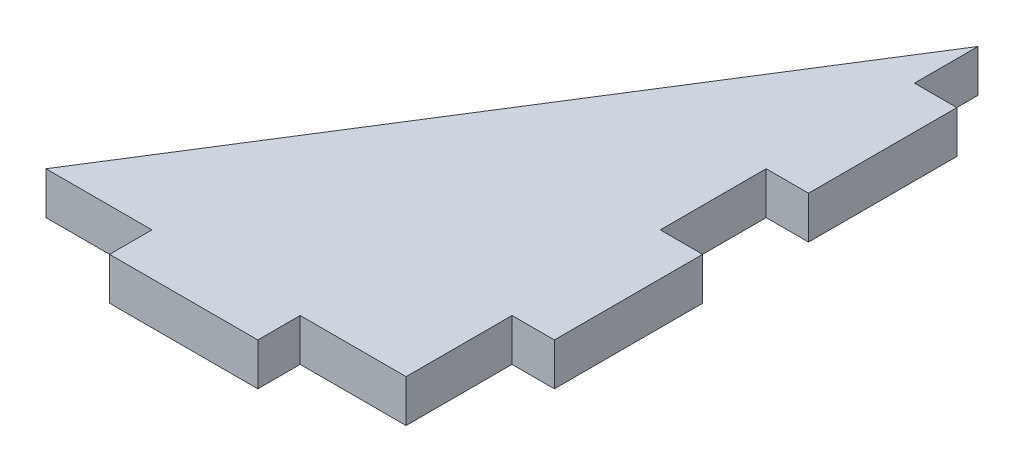
ISO-10303-21;
HEADER;
FILE_DESCRIPTION(('STEP AP214'),'2;1');
FILE_NAME('part.step','',(''),(''),'','','');
FILE_SCHEMA(('AUTOMOTIVE_DESIGN { 1 0 10303 214 1 1 1 1 }'));
ENDSEC;
DATA;
#1=APPLICATION_CONTEXT('core data for automotive mechanical design processes');
#2=APPLICATION_PROTOCOL_DEFINITION('international standard','automotive_design',2000,#1);
#3=PRODUCT_CONTEXT('',#1,'mechanical');
#4=PRODUCT('Part','Part','',(#3));
#5=PRODUCT_RELATED_PRODUCT_CATEGORY('part','',(#4));
#6=PRODUCT_DEFINITION_FORMATION('','',#4);
#7=PRODUCT_DEFINITION_CONTEXT('part definition',#1,'design');
#8=PRODUCT_DEFINITION('design','',#6,#7);
#9=PRODUCT_DEFINITION_SHAPE('','',#8);
#10=(LENGTH_UNIT() NAMED_UNIT(*) SI_UNIT(.MILLI.,.METRE.));
#11=(NAMED_UNIT(*) PLANE_ANGLE_UNIT() SI_UNIT($,.RADIAN.));
#12=(NAMED_UNIT(*) SI_UNIT($,.STERADIAN.) SOLID_ANGLE_UNIT());
#13=UNCERTAINTY_MEASURE_WITH_UNIT(LENGTH_MEASURE(1.E-05),#10,'distance_accuracy_value','');
#14=(GEOMETRIC_REPRESENTATION_CONTEXT(3) GLOBAL_UNCERTAINTY_ASSIGNED_CONTEXT((#13)) GLOBAL_UNIT_ASSIGNED_CONTEXT((#10,
#11,#12)) REPRESENTATION_CONTEXT('',''));
#15=CARTESIAN_POINT('',(0.,0.,0.));
#16=DIRECTION('',(0.,0.,1.));
#17=DIRECTION('',(1.,0.,0.));
#18=AXIS2_PLACEMENT_3D('',#15,#16,#17);
#19=CARTESIAN_POINT('',(0.,2.,0.));
#20=DIRECTION('',(1.,0.,0.));
#21=DIRECTION('',(0.,0.,-1.));
#22=AXIS2_PLACEMENT_3D('',#19,#20,#21);
#23=PLANE('',#22);
#24=DIRECTION('',(0.,0.,1.));
#25=VECTOR('',#24,1.);
#26=CARTESIAN_POINT('',(0.,0.,0.));
#27=LINE('',#26,#25);
#28=CARTESIAN_POINT('',(0.,0.,-27.));
#29=VERTEX_POINT('',#28);
#30=CARTESIAN_POINT('',(0.,0.,-24.));
#31=VERTEX_POINT('',#30);
#32=EDGE_CURVE('E171',#29,#31,#27,.T.);
#33=ORIENTED_EDGE('',*,*,#32,.F.);
#34=DIRECTION('',(0.,-1.,0.));
#35=VECTOR('',#34,1.);
#36=CARTESIAN_POINT('',(0.,2.,-27.));
#37=LINE('',#36,#35);
#38=CARTESIAN_POINT('',(0.,2.,-27.));
#39=VERTEX_POINT('',#38);
#40=EDGE_CURVE('E11',#39,#29,#37,.T.);
#41=ORIENTED_EDGE('',*,*,#40,.F.);
#42=DIRECTION('',(0.,0.,1.));
#43=VECTOR('',#42,1.);
#44=CARTESIAN_POINT('',(0.,2.,0.));
#45=LINE('',#44,#43);
#46=CARTESIAN_POINT('',(0.,2.,-24.));
#47=VERTEX_POINT('',#46);
#48=EDGE_CURVE('E204',#39,#47,#45,.T.);
#49=ORIENTED_EDGE('',*,*,#48,.T.);
#50=DIRECTION('',(0.,-1.,0.));
#51=VECTOR('',#50,1.);
#52=CARTESIAN_POINT('',(0.,2.,-24.));
#53=LINE('',#52,#51);
#54=EDGE_CURVE('E52',#47,#31,#53,.T.);
#55=ORIENTED_EDGE('',*,*,#54,.T.);
#56=EDGE_LOOP('',(#33,#41,#49,#55));
#57=FACE_BOUND('',#56,.T.);
#58=ADVANCED_FACE('F35',(#57),#23,.T.);
#59=CARTESIAN_POINT('',(-12.1738703339882,2.,-7.66502946954813));
#60=DIRECTION('',(-0.846232840089751,0.,-0.532813269686139));
#61=DIRECTION('',(-0.532813269686139,0.,0.846232840089751));
#62=AXIS2_PLACEMENT_3D('',#59,#60,#61);
#63=PLANE('',#62);
#64=DIRECTION('',(0.532813269686139,0.,-0.846232840089751));
#65=VECTOR('',#64,1.);
#66=CARTESIAN_POINT('',(-12.1738703339882,0.,-7.66502946954813));
#67=LINE('',#66,#65);
#68=CARTESIAN_POINT('',(-17.,0.,0.));
#69=VERTEX_POINT('',#68);
#70=EDGE_CURVE('E173',#69,#29,#67,.T.);
#71=ORIENTED_EDGE('',*,*,#70,.F.);
#72=DIRECTION('',(0.,-1.,0.));
#73=VECTOR('',#72,1.);
#74=CARTESIAN_POINT('',(-17.,2.,0.));
#75=LINE('',#74,#73);
#76=CARTESIAN_POINT('',(-17.,2.,0.));
#77=VERTEX_POINT('',#76);
#78=EDGE_CURVE('E44',#77,#69,#75,.T.);
#79=ORIENTED_EDGE('',*,*,#78,.F.);
#80=DIRECTION('',(0.532813269686139,0.,-0.846232840089751));
#81=VECTOR('',#80,1.);
#82=CARTESIAN_POINT('',(-12.1738703339882,2.,-7.66502946954813));
#83=LINE('',#82,#81);
#84=EDGE_CURVE('E271',#77,#39,#83,.T.);
#85=ORIENTED_EDGE('',*,*,#84,.T.);
#86=ORIENTED_EDGE('',*,*,#40,.T.);
#87=EDGE_LOOP('',(#71,#79,#85,#86));
#88=FACE_BOUND('',#87,.T.);
#89=ADVANCED_FACE('F37',(#88),#63,.T.);
#90=CARTESIAN_POINT('',(0.,2.,0.));
#91=DIRECTION('',(0.,0.,1.));
#92=DIRECTION('',(1.,0.,0.));
#93=AXIS2_PLACEMENT_3D('',#90,#91,#92);
#94=PLANE('',#93);
#95=DIRECTION('',(-1.,0.,0.));
#96=VECTOR('',#95,1.);
#97=CARTESIAN_POINT('',(0.,0.,0.));
#98=LINE('',#97,#96);
#99=CARTESIAN_POINT('',(-12.,0.,0.));
#100=VERTEX_POINT('',#99);
#101=EDGE_CURVE('E178',#100,#69,#98,.T.);
#102=ORIENTED_EDGE('',*,*,#101,.F.);
#103=DIRECTION('',(0.,-1.,0.));
#104=VECTOR('',#103,1.);
#105=CARTESIAN_POINT('',(-12.,2.,0.));
#106=LINE('',#105,#104);
#107=CARTESIAN_POINT('',(-12.,2.,0.));
#108=VERTEX_POINT('',#107);
#109=EDGE_CURVE('E226',#108,#100,#106,.T.);
#110=ORIENTED_EDGE('',*,*,#109,.F.);
#111=DIRECTION('',(-1.,0.,0.));
#112=VECTOR('',#111,1.);
#113=CARTESIAN_POINT('',(0.,2.,0.));
#114=LINE('',#113,#112);
#115=EDGE_CURVE('E233',#108,#77,#114,.T.);
#116=ORIENTED_EDGE('',*,*,#115,.T.);
#117=ORIENTED_EDGE('',*,*,#78,.T.);
#118=EDGE_LOOP('',(#102,#110,#116,#117));
#119=FACE_BOUND('',#118,.T.);
#120=ADVANCED_FACE('F231',(#119),#94,.T.);
#121=CARTESIAN_POINT('',(-12.,2.,0.));
#122=DIRECTION('',(1.,0.,0.));
#123=DIRECTION('',(0.,0.,-1.));
#124=AXIS2_PLACEMENT_3D('',#121,#122,#123);
#125=PLANE('',#124);
#126=DIRECTION('',(0.,0.,1.));
#127=VECTOR('',#126,1.);
#128=CARTESIAN_POINT('',(-12.,0.,0.));
#129=LINE('',#128,#127);
#130=CARTESIAN_POINT('',(-12.,0.,2.));
#131=VERTEX_POINT('',#130);
#132=EDGE_CURVE('E181',#100,#131,#129,.T.);
#133=ORIENTED_EDGE('',*,*,#132,.T.);
#134=DIRECTION('',(0.,-1.,0.));
#135=VECTOR('',#134,1.);
#136=CARTESIAN_POINT('',(-12.,2.,2.));
#137=LINE('',#136,#135);
#138=CARTESIAN_POINT('',(-12.,2.,2.));
#139=VERTEX_POINT('',#138);
#140=EDGE_CURVE('E223',#139,#131,#137,.T.);
#141=ORIENTED_EDGE('',*,*,#140,.F.);
#142=DIRECTION('',(0.,0.,1.));
#143=VECTOR('',#142,1.);
#144=CARTESIAN_POINT('',(-12.,2.,0.));
#145=LINE('',#144,#143);
#146=EDGE_CURVE('E253',#108,#139,#145,.T.);
#147=ORIENTED_EDGE('',*,*,#146,.F.);
#148=ORIENTED_EDGE('',*,*,#109,.T.);
#149=EDGE_LOOP('',(#133,#141,#147,#148));
#150=FACE_BOUND('',#149,.T.);
#151=ADVANCED_FACE('F243',(#150),#125,.F.);
#152=CARTESIAN_POINT('',(0.,2.,2.));
#153=DIRECTION('',(0.,0.,-1.));
#154=DIRECTION('',(-1.,0.,0.));
#155=AXIS2_PLACEMENT_3D('',#152,#153,#154);
#156=PLANE('',#155);
#157=DIRECTION('',(1.,0.,0.));
#158=VECTOR('',#157,1.);
#159=CARTESIAN_POINT('',(0.,0.,2.));
#160=LINE('',#159,#158);
#161=CARTESIAN_POINT('',(-5.,0.,2.));
#162=VERTEX_POINT('',#161);
#163=EDGE_CURVE('E184',#131,#162,#160,.T.);
#164=ORIENTED_EDGE('',*,*,#163,.T.);
#165=DIRECTION('',(0.,-1.,0.));
#166=VECTOR('',#165,1.);
#167=CARTESIAN_POINT('',(-5.,2.,2.));
#168=LINE('',#167,#166);
#169=CARTESIAN_POINT('',(-5.,2.,2.));
#170=VERTEX_POINT('',#169);
#171=EDGE_CURVE('E221',#170,#162,#168,.T.);
#172=ORIENTED_EDGE('',*,*,#171,.F.);
#173=DIRECTION('',(1.,0.,0.));
#174=VECTOR('',#173,1.);
#175=CARTESIAN_POINT('',(0.,2.,2.));
#176=LINE('',#175,#174);
#177=EDGE_CURVE('E249',#139,#170,#176,.T.);
#178=ORIENTED_EDGE('',*,*,#177,.F.);
#179=ORIENTED_EDGE('',*,*,#140,.T.);
#180=EDGE_LOOP('',(#164,#172,#178,#179));
#181=FACE_BOUND('',#180,.T.);
#182=ADVANCED_FACE('F247',(#181),#156,.F.);
#183=CARTESIAN_POINT('',(-5.,2.,0.));
#184=DIRECTION('',(1.,0.,0.));
#185=DIRECTION('',(0.,0.,-1.));
#186=AXIS2_PLACEMENT_3D('',#183,#184,#185);
#187=PLANE('',#186);
#188=DIRECTION('',(0.,0.,1.));
#189=VECTOR('',#188,1.);
#190=CARTESIAN_POINT('',(-5.,0.,0.));
#191=LINE('',#190,#189);
#192=CARTESIAN_POINT('',(-5.,0.,0.));
#193=VERTEX_POINT('',#192);
#194=EDGE_CURVE('E187',#193,#162,#191,.T.);
#195=ORIENTED_EDGE('',*,*,#194,.F.);
#196=DIRECTION('',(0.,-1.,0.));
#197=VECTOR('',#196,1.);
#198=CARTESIAN_POINT('',(-5.,2.,0.));
#199=LINE('',#198,#197);
#200=CARTESIAN_POINT('',(-5.,2.,0.));
#201=VERTEX_POINT('',#200);
#202=EDGE_CURVE('E219',#201,#193,#199,.T.);
#203=ORIENTED_EDGE('',*,*,#202,.F.);
#204=DIRECTION('',(0.,0.,1.));
#205=VECTOR('',#204,1.);
#206=CARTESIAN_POINT('',(-5.,2.,0.));
#207=LINE('',#206,#205);
#208=EDGE_CURVE('E252',#201,#170,#207,.T.);
#209=ORIENTED_EDGE('',*,*,#208,.T.);
#210=ORIENTED_EDGE('',*,*,#171,.T.);
#211=EDGE_LOOP('',(#195,#203,#209,#210));
#212=FACE_BOUND('',#211,.T.);
#213=ADVANCED_FACE('F299',(#212),#187,.T.);
#214=CARTESIAN_POINT('',(0.,0.,0.));
#215=VERTEX_POINT('',#214);
#216=EDGE_CURVE('E182',#215,#193,#98,.T.);
#217=ORIENTED_EDGE('',*,*,#216,.F.);
#218=DIRECTION('',(0.,-1.,0.));
#219=VECTOR('',#218,1.);
#220=CARTESIAN_POINT('',(0.,2.,0.));
#221=LINE('',#220,#219);
#222=CARTESIAN_POINT('',(0.,2.,0.));
#223=VERTEX_POINT('',#222);
#224=EDGE_CURVE('E217',#223,#215,#221,.T.);
#225=ORIENTED_EDGE('',*,*,#224,.F.);
#226=EDGE_CURVE('E255',#223,#201,#114,.T.);
#227=ORIENTED_EDGE('',*,*,#226,.T.);
#228=ORIENTED_EDGE('',*,*,#202,.T.);
#229=EDGE_LOOP('',(#217,#225,#227,#228));
#230=FACE_BOUND('',#229,.T.);
#231=ADVANCED_FACE('F276',(#230),#94,.T.);
#232=CARTESIAN_POINT('',(0.,0.,-5.));
#233=VERTEX_POINT('',#232);
#234=EDGE_CURVE('E175',#233,#215,#27,.T.);
#235=ORIENTED_EDGE('',*,*,#234,.F.);
#236=DIRECTION('',(0.,-1.,0.));
#237=VECTOR('',#236,1.);
#238=CARTESIAN_POINT('',(0.,2.,-5.));
#239=LINE('',#238,#237);
#240=CARTESIAN_POINT('',(0.,2.,-5.));
#241=VERTEX_POINT('',#240);
#242=EDGE_CURVE('E215',#241,#233,#239,.T.);
#243=ORIENTED_EDGE('',*,*,#242,.F.);
#244=EDGE_CURVE('E263',#241,#223,#45,.T.);
#245=ORIENTED_EDGE('',*,*,#244,.T.);
#246=ORIENTED_EDGE('',*,*,#224,.T.);
#247=EDGE_LOOP('',(#235,#243,#245,#246));
#248=FACE_BOUND('',#247,.T.);
#249=ADVANCED_FACE('F281',(#248),#23,.T.);
#250=CARTESIAN_POINT('',(0.,2.,-5.));
#251=DIRECTION('',(0.,0.,-1.));
#252=DIRECTION('',(-1.,0.,0.));
#253=AXIS2_PLACEMENT_3D('',#250,#251,#252);
#254=PLANE('',#253);
#255=DIRECTION('',(1.,0.,0.));
#256=VECTOR('',#255,1.);
#257=CARTESIAN_POINT('',(0.,0.,-5.));
#258=LINE('',#257,#256);
#259=CARTESIAN_POINT('',(2.,0.,-5.));
#260=VERTEX_POINT('',#259);
#261=EDGE_CURVE('E190',#233,#260,#258,.T.);
#262=ORIENTED_EDGE('',*,*,#261,.T.);
#263=DIRECTION('',(0.,-1.,0.));
#264=VECTOR('',#263,1.);
#265=CARTESIAN_POINT('',(2.,2.,-5.));
#266=LINE('',#265,#264);
#267=CARTESIAN_POINT('',(2.,2.,-5.));
#268=VERTEX_POINT('',#267);
#269=EDGE_CURVE('E212',#268,#260,#266,.T.);
#270=ORIENTED_EDGE('',*,*,#269,.F.);
#271=DIRECTION('',(1.,0.,0.));
#272=VECTOR('',#271,1.);
#273=CARTESIAN_POINT('',(0.,2.,-5.));
#274=LINE('',#273,#272);
#275=EDGE_CURVE('E260',#241,#268,#274,.T.);
#276=ORIENTED_EDGE('',*,*,#275,.F.);
#277=ORIENTED_EDGE('',*,*,#242,.T.);
#278=EDGE_LOOP('',(#262,#270,#276,#277));
#279=FACE_BOUND('',#278,.T.);
#280=ADVANCED_FACE('F287',(#279),#254,.F.);
#281=CARTESIAN_POINT('',(2.,2.,0.));
#282=DIRECTION('',(-1.,0.,0.));
#283=DIRECTION('',(0.,0.,1.));
#284=AXIS2_PLACEMENT_3D('',#281,#282,#283);
#285=PLANE('',#284);
#286=DIRECTION('',(0.,0.,-1.));
#287=VECTOR('',#286,1.);
#288=CARTESIAN_POINT('',(2.,0.,0.));
#289=LINE('',#288,#287);
#290=CARTESIAN_POINT('',(2.,0.,-12.));
#291=VERTEX_POINT('',#290);
#292=EDGE_CURVE('E192',#260,#291,#289,.T.);
#293=ORIENTED_EDGE('',*,*,#292,.T.);
#294=DIRECTION('',(0.,-1.,0.));
#295=VECTOR('',#294,1.);
#296=CARTESIAN_POINT('',(2.,2.,-12.));
#297=LINE('',#296,#295);
#298=CARTESIAN_POINT('',(2.,2.,-12.));
#299=VERTEX_POINT('',#298);
#300=EDGE_CURVE('E210',#299,#291,#297,.T.);
#301=ORIENTED_EDGE('',*,*,#300,.F.);
#302=DIRECTION('',(0.,0.,-1.));
#303=VECTOR('',#302,1.);
#304=CARTESIAN_POINT('',(2.,2.,0.));
#305=LINE('',#304,#303);
#306=EDGE_CURVE('E262',#268,#299,#305,.T.);
#307=ORIENTED_EDGE('',*,*,#306,.F.);
#308=ORIENTED_EDGE('',*,*,#269,.T.);
#309=EDGE_LOOP('',(#293,#301,#307,#308));
#310=FACE_BOUND('',#309,.T.);
#311=ADVANCED_FACE('F291',(#310),#285,.F.);
#312=CARTESIAN_POINT('',(0.,2.,-12.));
#313=DIRECTION('',(0.,0.,-1.));
#314=DIRECTION('',(-1.,0.,0.));
#315=AXIS2_PLACEMENT_3D('',#312,#313,#314);
#316=PLANE('',#315);
#317=DIRECTION('',(1.,0.,0.));
#318=VECTOR('',#317,1.);
#319=CARTESIAN_POINT('',(0.,0.,-12.));
#320=LINE('',#319,#318);
#321=CARTESIAN_POINT('',(0.,0.,-12.));
#322=VERTEX_POINT('',#321);
#323=EDGE_CURVE('E195',#322,#291,#320,.T.);
#324=ORIENTED_EDGE('',*,*,#323,.F.);
#325=DIRECTION('',(0.,-1.,0.));
#326=VECTOR('',#325,1.);
#327=CARTESIAN_POINT('',(0.,2.,-12.));
#328=LINE('',#327,#326);
#329=CARTESIAN_POINT('',(0.,2.,-12.));
#330=VERTEX_POINT('',#329);
#331=EDGE_CURVE('E208',#330,#322,#328,.T.);
#332=ORIENTED_EDGE('',*,*,#331,.F.);
#333=DIRECTION('',(1.,0.,0.));
#334=VECTOR('',#333,1.);
#335=CARTESIAN_POINT('',(0.,2.,-12.));
#336=LINE('',#335,#334);
#337=EDGE_CURVE('E264',#330,#299,#336,.T.);
#338=ORIENTED_EDGE('',*,*,#337,.T.);
#339=ORIENTED_EDGE('',*,*,#300,.T.);
#340=EDGE_LOOP('',(#324,#332,#338,#339));
#341=FACE_BOUND('',#340,.T.);
#342=ADVANCED_FACE('F294',(#341),#316,.T.);
#343=CARTESIAN_POINT('',(0.,0.,-17.));
#344=VERTEX_POINT('',#343);
#345=EDGE_CURVE('E174',#344,#322,#27,.T.);
#346=ORIENTED_EDGE('',*,*,#345,.F.);
#347=DIRECTION('',(0.,-1.,0.));
#348=VECTOR('',#347,1.);
#349=CARTESIAN_POINT('',(0.,2.,-17.));
#350=LINE('',#349,#348);
#351=CARTESIAN_POINT('',(0.,2.,-17.));
#352=VERTEX_POINT('',#351);
#353=EDGE_CURVE('E163',#352,#344,#350,.T.);
#354=ORIENTED_EDGE('',*,*,#353,.F.);
#355=EDGE_CURVE('E153',#352,#330,#45,.T.);
#356=ORIENTED_EDGE('',*,*,#355,.T.);
#357=ORIENTED_EDGE('',*,*,#331,.T.);
#358=EDGE_LOOP('',(#346,#354,#356,#357));
#359=FACE_BOUND('',#358,.T.);
#360=ADVANCED_FACE('F310',(#359),#23,.T.);
#361=CARTESIAN_POINT('',(0.,2.,-17.));
#362=DIRECTION('',(0.,0.,-1.));
#363=DIRECTION('',(-1.,0.,0.));
#364=AXIS2_PLACEMENT_3D('',#361,#362,#363);
#365=PLANE('',#364);
#366=DIRECTION('',(1.,0.,0.));
#367=VECTOR('',#366,1.);
#368=CARTESIAN_POINT('',(0.,0.,-17.));
#369=LINE('',#368,#367);
#370=CARTESIAN_POINT('',(2.,0.,-17.));
#371=VERTEX_POINT('',#370);
#372=EDGE_CURVE('E160',#344,#371,#369,.T.);
#373=ORIENTED_EDGE('',*,*,#372,.T.);
#374=DIRECTION('',(0.,-1.,0.));
#375=VECTOR('',#374,1.);
#376=CARTESIAN_POINT('',(2.,2.,-17.));
#377=LINE('',#376,#375);
#378=CARTESIAN_POINT('',(2.,2.,-17.));
#379=VERTEX_POINT('',#378);
#380=EDGE_CURVE('E157',#379,#371,#377,.T.);
#381=ORIENTED_EDGE('',*,*,#380,.F.);
#382=DIRECTION('',(1.,0.,0.));
#383=VECTOR('',#382,1.);
#384=CARTESIAN_POINT('',(0.,2.,-17.));
#385=LINE('',#384,#383);
#386=EDGE_CURVE('E145',#352,#379,#385,.T.);
#387=ORIENTED_EDGE('',*,*,#386,.F.);
#388=ORIENTED_EDGE('',*,*,#353,.T.);
#389=EDGE_LOOP('',(#373,#381,#387,#388));
#390=FACE_BOUND('',#389,.T.);
#391=ADVANCED_FACE('F158',(#390),#365,.F.);
#392=CARTESIAN_POINT('',(2.,2.,0.));
#393=DIRECTION('',(-1.,0.,0.));
#394=DIRECTION('',(0.,0.,1.));
#395=AXIS2_PLACEMENT_3D('',#392,#393,#394);
#396=PLANE('',#395);
#397=DIRECTION('',(0.,0.,-1.));
#398=VECTOR('',#397,1.);
#399=CARTESIAN_POINT('',(2.,0.,0.));
#400=LINE('',#399,#398);
#401=CARTESIAN_POINT('',(2.,0.,-24.));
#402=VERTEX_POINT('',#401);
#403=EDGE_CURVE('E199',#371,#402,#400,.T.);
#404=ORIENTED_EDGE('',*,*,#403,.T.);
#405=DIRECTION('',(0.,-1.,0.));
#406=VECTOR('',#405,1.);
#407=CARTESIAN_POINT('',(2.,2.,-24.));
#408=LINE('',#407,#406);
#409=CARTESIAN_POINT('',(2.,2.,-24.));
#410=VERTEX_POINT('',#409);
#411=EDGE_CURVE('E99',#410,#402,#408,.T.);
#412=ORIENTED_EDGE('',*,*,#411,.F.);
#413=DIRECTION('',(0.,0.,-1.));
#414=VECTOR('',#413,1.);
#415=CARTESIAN_POINT('',(2.,2.,0.));
#416=LINE('',#415,#414);
#417=EDGE_CURVE('E150',#379,#410,#416,.T.);
#418=ORIENTED_EDGE('',*,*,#417,.F.);
#419=ORIENTED_EDGE('',*,*,#380,.T.);
#420=EDGE_LOOP('',(#404,#412,#418,#419));
#421=FACE_BOUND('',#420,.T.);
#422=ADVANCED_FACE('F165',(#421),#396,.F.);
#423=CARTESIAN_POINT('',(0.,2.,-24.));
#424=DIRECTION('',(0.,0.,-1.));
#425=DIRECTION('',(-1.,0.,0.));
#426=AXIS2_PLACEMENT_3D('',#423,#424,#425);
#427=PLANE('',#426);
#428=DIRECTION('',(1.,0.,0.));
#429=VECTOR('',#428,1.);
#430=CARTESIAN_POINT('',(0.,0.,-24.));
#431=LINE('',#430,#429);
#432=EDGE_CURVE('E201',#31,#402,#431,.T.);
#433=ORIENTED_EDGE('',*,*,#432,.F.);
#434=ORIENTED_EDGE('',*,*,#54,.F.);
#435=DIRECTION('',(1.,0.,0.));
#436=VECTOR('',#435,1.);
#437=CARTESIAN_POINT('',(0.,2.,-24.));
#438=LINE('',#437,#436);
#439=EDGE_CURVE('E166',#47,#410,#438,.T.);
#440=ORIENTED_EDGE('',*,*,#439,.T.);
#441=ORIENTED_EDGE('',*,*,#411,.T.);
#442=EDGE_LOOP('',(#433,#434,#440,#441));
#443=FACE_BOUND('',#442,.T.);
#444=ADVANCED_FACE('F361',(#443),#427,.T.);
#445=CARTESIAN_POINT('',(0.,2.,0.));
#446=DIRECTION('',(0.,1.,0.));
#447=DIRECTION('',(0.,0.,1.));
#448=AXIS2_PLACEMENT_3D('',#445,#446,#447);
#449=PLANE('',#448);
#450=ORIENTED_EDGE('',*,*,#48,.F.);
#451=ORIENTED_EDGE('',*,*,#84,.F.);
#452=ORIENTED_EDGE('',*,*,#115,.F.);
#453=ORIENTED_EDGE('',*,*,#146,.T.);
#454=ORIENTED_EDGE('',*,*,#177,.T.);
#455=ORIENTED_EDGE('',*,*,#208,.F.);
#456=ORIENTED_EDGE('',*,*,#226,.F.);
#457=ORIENTED_EDGE('',*,*,#244,.F.);
#458=ORIENTED_EDGE('',*,*,#275,.T.);
#459=ORIENTED_EDGE('',*,*,#306,.T.);
#460=ORIENTED_EDGE('',*,*,#337,.F.);
#461=ORIENTED_EDGE('',*,*,#355,.F.);
#462=ORIENTED_EDGE('',*,*,#386,.T.);
#463=ORIENTED_EDGE('',*,*,#417,.T.);
#464=ORIENTED_EDGE('',*,*,#439,.F.);
#465=EDGE_LOOP('',(#450,#451,#452,#453,#454,#455,#456,#457,#458,#459,#460,#461,#462,#463,#464));
#466=FACE_BOUND('',#465,.T.);
#467=ADVANCED_FACE('F147',(#466),#449,.T.);
#468=CARTESIAN_POINT('',(0.,0.,0.));
#469=DIRECTION('',(0.,1.,0.));
#470=DIRECTION('',(0.,0.,1.));
#471=AXIS2_PLACEMENT_3D('',#468,#469,#470);
#472=PLANE('',#471);
#473=ORIENTED_EDGE('',*,*,#32,.T.);
#474=ORIENTED_EDGE('',*,*,#432,.T.);
#475=ORIENTED_EDGE('',*,*,#403,.F.);
#476=ORIENTED_EDGE('',*,*,#372,.F.);
#477=ORIENTED_EDGE('',*,*,#345,.T.);
#478=ORIENTED_EDGE('',*,*,#323,.T.);
#479=ORIENTED_EDGE('',*,*,#292,.F.);
#480=ORIENTED_EDGE('',*,*,#261,.F.);
#481=ORIENTED_EDGE('',*,*,#234,.T.);
#482=ORIENTED_EDGE('',*,*,#216,.T.);
#483=ORIENTED_EDGE('',*,*,#194,.T.);
#484=ORIENTED_EDGE('',*,*,#163,.F.);
#485=ORIENTED_EDGE('',*,*,#132,.F.);
#486=ORIENTED_EDGE('',*,*,#101,.T.);
#487=ORIENTED_EDGE('',*,*,#70,.T.);
#488=EDGE_LOOP('',(#473,#474,#475,#476,#477,#478,#479,#480,#481,#482,#483,#484,#485,#486,#487));
#489=FACE_BOUND('',#488,.T.);
#490=ADVANCED_FACE('F239',(#489),#472,.F.);
#491=CLOSED_SHELL('',(#58,#89,#120,#151,#182,#213,#231,#249,#280,#311,#342,#360,#391,#422,#444,
#467,#490));
#492=MANIFOLD_SOLID_BREP('B2',#491);
#493=ADVANCED_BREP_SHAPE_REPRESENTATION('',(#18,#492),#14);
#494=SHAPE_DEFINITION_REPRESENTATION(#9,#493);
ENDSEC;
END-ISO-10303-21;
